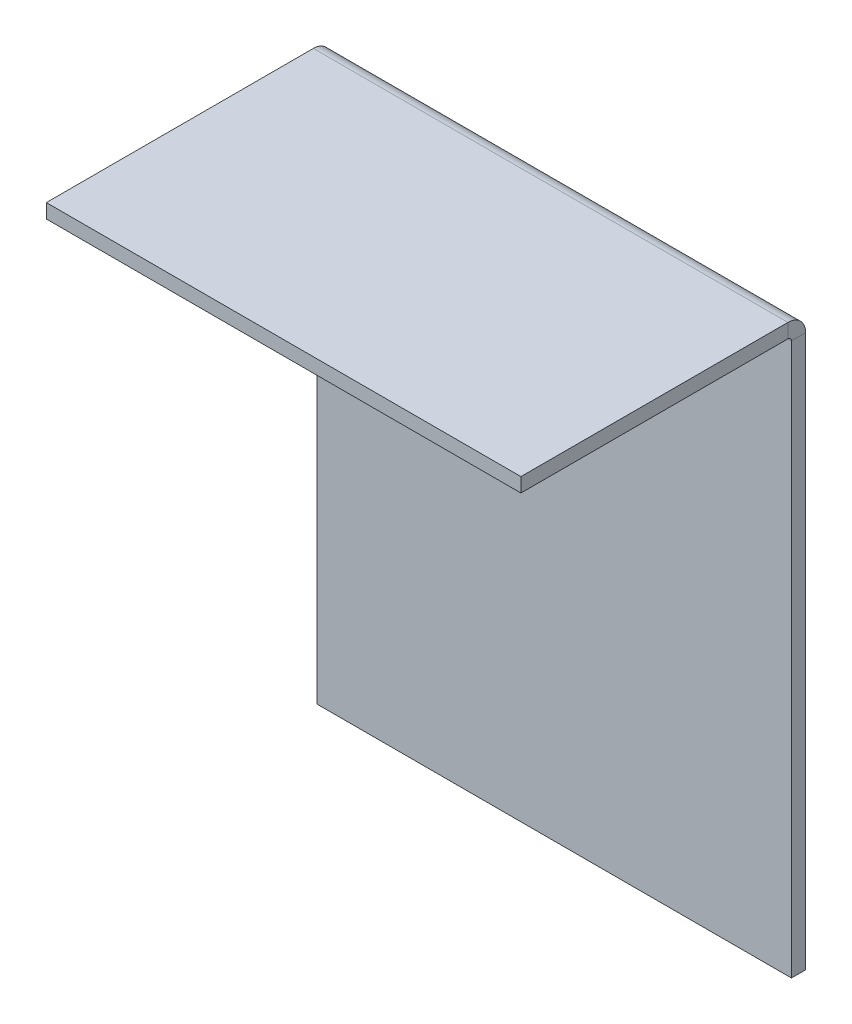
ISO-10303-21;
HEADER;
FILE_DESCRIPTION(('STEP AP214'),'2;1');
FILE_NAME('part.step','',(''),(''),'','','');
FILE_SCHEMA(('AUTOMOTIVE_DESIGN { 1 0 10303 214 1 1 1 1 }'));
ENDSEC;
DATA;
#1=APPLICATION_CONTEXT('core data for automotive mechanical design processes');
#2=APPLICATION_PROTOCOL_DEFINITION('international standard','automotive_design',2000,#1);
#3=PRODUCT_CONTEXT('',#1,'mechanical');
#4=PRODUCT('Part','Part','',(#3));
#5=PRODUCT_RELATED_PRODUCT_CATEGORY('part','',(#4));
#6=PRODUCT_DEFINITION_FORMATION('','',#4);
#7=PRODUCT_DEFINITION_CONTEXT('part definition',#1,'design');
#8=PRODUCT_DEFINITION('design','',#6,#7);
#9=PRODUCT_DEFINITION_SHAPE('','',#8);
#10=(LENGTH_UNIT() NAMED_UNIT(*) SI_UNIT(.MILLI.,.METRE.));
#11=(NAMED_UNIT(*) PLANE_ANGLE_UNIT() SI_UNIT($,.RADIAN.));
#12=(NAMED_UNIT(*) SI_UNIT($,.STERADIAN.) SOLID_ANGLE_UNIT());
#13=UNCERTAINTY_MEASURE_WITH_UNIT(LENGTH_MEASURE(1.E-05),#10,'distance_accuracy_value','');
#14=(GEOMETRIC_REPRESENTATION_CONTEXT(3) GLOBAL_UNCERTAINTY_ASSIGNED_CONTEXT((#13)) GLOBAL_UNIT_ASSIGNED_CONTEXT((#10,
#11,#12)) REPRESENTATION_CONTEXT('',''));
#15=CARTESIAN_POINT('',(0.,0.,0.));
#16=DIRECTION('',(0.,0.,1.));
#17=DIRECTION('',(1.,0.,0.));
#18=AXIS2_PLACEMENT_3D('',#15,#16,#17);
#19=CARTESIAN_POINT('',(-50.,60.,-3.));
#20=DIRECTION('',(-1.,0.,0.));
#21=DIRECTION('',(0.,-1.,0.));
#22=AXIS2_PLACEMENT_3D('',#19,#20,#21);
#23=PLANE('',#22);
#24=DIRECTION('',(0.,-1.,0.));
#25=VECTOR('',#24,1.);
#26=CARTESIAN_POINT('',(-50.,60.,0.));
#27=LINE('',#26,#25);
#28=CARTESIAN_POINT('',(-50.,56.2634,0.));
#29=VERTEX_POINT('',#28);
#30=CARTESIAN_POINT('',(-50.,-60.,0.));
#31=VERTEX_POINT('',#30);
#32=EDGE_CURVE('E110',#29,#31,#27,.T.);
#33=ORIENTED_EDGE('',*,*,#32,.F.);
#34=DIRECTION('',(0.,0.,-1.));
#35=VECTOR('',#34,1.);
#36=CARTESIAN_POINT('',(-50.,56.2634,0.));
#37=LINE('',#36,#35);
#38=CARTESIAN_POINT('',(-50.,56.2634,-3.));
#39=VERTEX_POINT('',#38);
#40=EDGE_CURVE('E118',#29,#39,#37,.T.);
#41=ORIENTED_EDGE('',*,*,#40,.T.);
#42=DIRECTION('',(0.,-1.,0.));
#43=VECTOR('',#42,1.);
#44=CARTESIAN_POINT('',(-50.,60.,-3.));
#45=LINE('',#44,#43);
#46=CARTESIAN_POINT('',(-50.,-60.,-3.));
#47=VERTEX_POINT('',#46);
#48=EDGE_CURVE('E114',#39,#47,#45,.T.);
#49=ORIENTED_EDGE('',*,*,#48,.T.);
#50=DIRECTION('',(0.,0.,1.));
#51=VECTOR('',#50,1.);
#52=CARTESIAN_POINT('',(-50.,-60.,-3.));
#53=LINE('',#52,#51);
#54=EDGE_CURVE('E69',#47,#31,#53,.T.);
#55=ORIENTED_EDGE('',*,*,#54,.T.);
#56=EDGE_LOOP('',(#33,#41,#49,#55));
#57=FACE_BOUND('',#56,.T.);
#58=ADVANCED_FACE('F62',(#57),#23,.T.);
#59=CARTESIAN_POINT('',(0.,0.,-3.));
#60=DIRECTION('',(0.,0.,1.));
#61=DIRECTION('',(1.,0.,0.));
#62=AXIS2_PLACEMENT_3D('',#59,#60,#61);
#63=PLANE('',#62);
#64=DIRECTION('',(-1.,0.,0.));
#65=VECTOR('',#64,1.);
#66=CARTESIAN_POINT('',(-50.,56.2634,-3.));
#67=LINE('',#66,#65);
#68=CARTESIAN_POINT('',(50.,56.2634,-3.));
#69=VERTEX_POINT('',#68);
#70=EDGE_CURVE('E131',#39,#69,#67,.F.);
#71=ORIENTED_EDGE('',*,*,#70,.T.);
#72=DIRECTION('',(0.,1.,0.));
#73=VECTOR('',#72,1.);
#74=CARTESIAN_POINT('',(50.,60.,-3.));
#75=LINE('',#74,#73);
#76=CARTESIAN_POINT('',(50.,-60.,-3.));
#77=VERTEX_POINT('',#76);
#78=EDGE_CURVE('E112',#77,#69,#75,.T.);
#79=ORIENTED_EDGE('',*,*,#78,.F.);
#80=DIRECTION('',(1.,0.,0.));
#81=VECTOR('',#80,1.);
#82=CARTESIAN_POINT('',(-50.,-60.,-3.));
#83=LINE('',#82,#81);
#84=EDGE_CURVE('E101',#47,#77,#83,.T.);
#85=ORIENTED_EDGE('',*,*,#84,.F.);
#86=ORIENTED_EDGE('',*,*,#48,.F.);
#87=EDGE_LOOP('',(#71,#79,#85,#86));
#88=FACE_BOUND('',#87,.T.);
#89=ADVANCED_FACE('F213',(#88),#63,.F.);
#90=CARTESIAN_POINT('',(0.,0.,0.));
#91=DIRECTION('',(0.,0.,1.));
#92=DIRECTION('',(1.,0.,0.));
#93=AXIS2_PLACEMENT_3D('',#90,#91,#92);
#94=PLANE('',#93);
#95=DIRECTION('',(0.,1.,0.));
#96=VECTOR('',#95,1.);
#97=CARTESIAN_POINT('',(50.,60.,0.));
#98=LINE('',#97,#96);
#99=CARTESIAN_POINT('',(50.,-60.,0.));
#100=VERTEX_POINT('',#99);
#101=CARTESIAN_POINT('',(50.,56.2634,0.));
#102=VERTEX_POINT('',#101);
#103=EDGE_CURVE('E103',#100,#102,#98,.T.);
#104=ORIENTED_EDGE('',*,*,#103,.T.);
#105=DIRECTION('',(-1.,0.,0.));
#106=VECTOR('',#105,1.);
#107=CARTESIAN_POINT('',(-50.,56.2634,0.));
#108=LINE('',#107,#106);
#109=EDGE_CURVE('E79',#29,#102,#108,.F.);
#110=ORIENTED_EDGE('',*,*,#109,.F.);
#111=ORIENTED_EDGE('',*,*,#32,.T.);
#112=DIRECTION('',(1.,0.,0.));
#113=VECTOR('',#112,1.);
#114=CARTESIAN_POINT('',(-50.,-60.,0.));
#115=LINE('',#114,#113);
#116=EDGE_CURVE('E97',#31,#100,#115,.T.);
#117=ORIENTED_EDGE('',*,*,#116,.T.);
#118=EDGE_LOOP('',(#104,#110,#111,#117));
#119=FACE_BOUND('',#118,.T.);
#120=ADVANCED_FACE('F108',(#119),#94,.T.);
#121=CARTESIAN_POINT('',(50.,60.,-3.));
#122=DIRECTION('',(1.,0.,0.));
#123=DIRECTION('',(0.,1.,0.));
#124=AXIS2_PLACEMENT_3D('',#121,#122,#123);
#125=PLANE('',#124);
#126=DIRECTION('',(0.,0.,-1.));
#127=VECTOR('',#126,1.);
#128=CARTESIAN_POINT('',(50.,56.2634,0.));
#129=LINE('',#128,#127);
#130=EDGE_CURVE('E106',#102,#69,#129,.T.);
#131=ORIENTED_EDGE('',*,*,#130,.F.);
#132=ORIENTED_EDGE('',*,*,#103,.F.);
#133=DIRECTION('',(0.,0.,1.));
#134=VECTOR('',#133,1.);
#135=CARTESIAN_POINT('',(50.,-60.,-3.));
#136=LINE('',#135,#134);
#137=EDGE_CURVE('E13',#77,#100,#136,.T.);
#138=ORIENTED_EDGE('',*,*,#137,.F.);
#139=ORIENTED_EDGE('',*,*,#78,.T.);
#140=EDGE_LOOP('',(#131,#132,#138,#139));
#141=FACE_BOUND('',#140,.T.);
#142=ADVANCED_FACE('F63',(#141),#125,.T.);
#143=CARTESIAN_POINT('',(-50.,-60.,-3.));
#144=DIRECTION('',(0.,-1.,0.));
#145=DIRECTION('',(0.,0.,-1.));
#146=AXIS2_PLACEMENT_3D('',#143,#144,#145);
#147=PLANE('',#146);
#148=ORIENTED_EDGE('',*,*,#116,.F.);
#149=ORIENTED_EDGE('',*,*,#54,.F.);
#150=ORIENTED_EDGE('',*,*,#84,.T.);
#151=ORIENTED_EDGE('',*,*,#137,.T.);
#152=EDGE_LOOP('',(#148,#149,#150,#151));
#153=FACE_BOUND('',#152,.T.);
#154=ADVANCED_FACE('F96',(#153),#147,.T.);
#155=CARTESIAN_POINT('',(50.,56.2634,0.7366));
#156=DIRECTION('',(1.,0.,0.));
#157=DIRECTION('',(0.,0.,-1.));
#158=AXIS2_PLACEMENT_3D('',#155,#156,#157);
#159=PLANE('',#158);
#160=DIRECTION('',(0.,-1.,0.));
#161=VECTOR('',#160,1.);
#162=CARTESIAN_POINT('',(50.,60.,0.736599999999986));
#163=LINE('',#162,#161);
#164=CARTESIAN_POINT('',(50.,57.,0.736599999999997));
#165=VERTEX_POINT('',#164);
#166=CARTESIAN_POINT('',(50.,60.,0.736599999999986));
#167=VERTEX_POINT('',#166);
#168=EDGE_CURVE('E139',#165,#167,#163,.F.);
#169=ORIENTED_EDGE('',*,*,#168,.F.);
#170=CARTESIAN_POINT('',(50.,56.2634,0.7366));
#171=DIRECTION('',(-1.,0.,0.));
#172=DIRECTION('',(0.,0.,1.));
#173=AXIS2_PLACEMENT_3D('',#170,#171,#172);
#174=CIRCLE('',#173,0.736599999999997);
#175=EDGE_CURVE('E129',#102,#165,#174,.F.);
#176=ORIENTED_EDGE('',*,*,#175,.F.);
#177=ORIENTED_EDGE('',*,*,#130,.T.);
#178=CARTESIAN_POINT('',(50.,56.2634,0.7366));
#179=DIRECTION('',(-1.,0.,0.));
#180=DIRECTION('',(0.,0.,1.));
#181=AXIS2_PLACEMENT_3D('',#178,#179,#180);
#182=CIRCLE('',#181,3.7366);
#183=EDGE_CURVE('E121',#69,#167,#182,.F.);
#184=ORIENTED_EDGE('',*,*,#183,.T.);
#185=EDGE_LOOP('',(#169,#176,#177,#184));
#186=FACE_BOUND('',#185,.T.);
#187=ADVANCED_FACE('F220',(#186),#159,.T.);
#188=CARTESIAN_POINT('',(-50.,56.2634,0.7366));
#189=DIRECTION('',(1.,0.,0.));
#190=DIRECTION('',(0.,0.,-1.));
#191=AXIS2_PLACEMENT_3D('',#188,#189,#190);
#192=PLANE('',#191);
#193=CARTESIAN_POINT('',(-50.,56.2634,0.7366));
#194=DIRECTION('',(-1.,0.,0.));
#195=DIRECTION('',(0.,0.,1.));
#196=AXIS2_PLACEMENT_3D('',#193,#194,#195);
#197=CIRCLE('',#196,0.736599999999997);
#198=CARTESIAN_POINT('',(-50.,57.,0.736599999999997));
#199=VERTEX_POINT('',#198);
#200=EDGE_CURVE('E123',#199,#29,#197,.T.);
#201=ORIENTED_EDGE('',*,*,#200,.F.);
#202=DIRECTION('',(0.,-1.,0.));
#203=VECTOR('',#202,1.);
#204=CARTESIAN_POINT('',(-50.,57.,0.736599999999997));
#205=LINE('',#204,#203);
#206=CARTESIAN_POINT('',(-50.,60.,0.736599999999986));
#207=VERTEX_POINT('',#206);
#208=EDGE_CURVE('E148',#199,#207,#205,.F.);
#209=ORIENTED_EDGE('',*,*,#208,.T.);
#210=CARTESIAN_POINT('',(-50.,56.2634,0.7366));
#211=DIRECTION('',(-1.,0.,0.));
#212=DIRECTION('',(0.,0.,1.));
#213=AXIS2_PLACEMENT_3D('',#210,#211,#212);
#214=CIRCLE('',#213,3.7366);
#215=EDGE_CURVE('E134',#207,#39,#214,.T.);
#216=ORIENTED_EDGE('',*,*,#215,.T.);
#217=ORIENTED_EDGE('',*,*,#40,.F.);
#218=EDGE_LOOP('',(#201,#209,#216,#217));
#219=FACE_BOUND('',#218,.T.);
#220=ADVANCED_FACE('F227',(#219),#192,.F.);
#221=CARTESIAN_POINT('',(-50.,56.2634,0.7366));
#222=DIRECTION('',(-1.,0.,0.));
#223=DIRECTION('',(0.,1.,0.));
#224=AXIS2_PLACEMENT_3D('',#221,#222,#223);
#225=CYLINDRICAL_SURFACE('',#224,3.7366);
#226=ORIENTED_EDGE('',*,*,#70,.F.);
#227=ORIENTED_EDGE('',*,*,#215,.F.);
#228=DIRECTION('',(-1.,0.,0.));
#229=VECTOR('',#228,1.);
#230=CARTESIAN_POINT('',(50.,60.,0.736599999999986));
#231=LINE('',#230,#229);
#232=EDGE_CURVE('E149',#207,#167,#231,.F.);
#233=ORIENTED_EDGE('',*,*,#232,.T.);
#234=ORIENTED_EDGE('',*,*,#183,.F.);
#235=EDGE_LOOP('',(#226,#227,#233,#234));
#236=FACE_BOUND('',#235,.T.);
#237=ADVANCED_FACE('F217',(#236),#225,.T.);
#238=CARTESIAN_POINT('',(-50.,56.2634,0.7366));
#239=DIRECTION('',(-1.,0.,0.));
#240=DIRECTION('',(0.,1.,0.));
#241=AXIS2_PLACEMENT_3D('',#238,#239,#240);
#242=CYLINDRICAL_SURFACE('',#241,0.736599999999997);
#243=ORIENTED_EDGE('',*,*,#109,.T.);
#244=ORIENTED_EDGE('',*,*,#175,.T.);
#245=DIRECTION('',(-1.,0.,0.));
#246=VECTOR('',#245,1.);
#247=CARTESIAN_POINT('',(50.,57.,0.736599999999997));
#248=LINE('',#247,#246);
#249=EDGE_CURVE('E141',#165,#199,#248,.T.);
#250=ORIENTED_EDGE('',*,*,#249,.T.);
#251=ORIENTED_EDGE('',*,*,#200,.T.);
#252=EDGE_LOOP('',(#243,#244,#250,#251));
#253=FACE_BOUND('',#252,.T.);
#254=ADVANCED_FACE('F230',(#253),#242,.F.);
#255=CARTESIAN_POINT('',(50.,60.,0.));
#256=DIRECTION('',(-1.,0.,0.));
#257=DIRECTION('',(0.,0.,1.));
#258=AXIS2_PLACEMENT_3D('',#255,#256,#257);
#259=PLANE('',#258);
#260=ORIENTED_EDGE('',*,*,#168,.T.);
#261=DIRECTION('',(0.,0.,-1.));
#262=VECTOR('',#261,1.);
#263=CARTESIAN_POINT('',(50.,60.,-2.22293310556855E-13));
#264=LINE('',#263,#262);
#265=CARTESIAN_POINT('',(50.,60.0000000000002,57.));
#266=VERTEX_POINT('',#265);
#267=EDGE_CURVE('E161',#266,#167,#264,.T.);
#268=ORIENTED_EDGE('',*,*,#267,.F.);
#269=DIRECTION('',(0.,-1.,0.));
#270=VECTOR('',#269,1.);
#271=CARTESIAN_POINT('',(50.,60.0000000000002,57.));
#272=LINE('',#271,#270);
#273=CARTESIAN_POINT('',(50.,57.0000000000002,57.));
#274=VERTEX_POINT('',#273);
#275=EDGE_CURVE('E168',#266,#274,#272,.T.);
#276=ORIENTED_EDGE('',*,*,#275,.T.);
#277=DIRECTION('',(0.,0.,1.));
#278=VECTOR('',#277,1.);
#279=CARTESIAN_POINT('',(50.,57.,0.));
#280=LINE('',#279,#278);
#281=EDGE_CURVE('E155',#274,#165,#280,.F.);
#282=ORIENTED_EDGE('',*,*,#281,.T.);
#283=EDGE_LOOP('',(#260,#268,#276,#282));
#284=FACE_BOUND('',#283,.T.);
#285=ADVANCED_FACE('F198',(#284),#259,.F.);
#286=CARTESIAN_POINT('',(-50.,60.0000000000002,57.));
#287=DIRECTION('',(1.,0.,0.));
#288=DIRECTION('',(0.,0.,-1.));
#289=AXIS2_PLACEMENT_3D('',#286,#287,#288);
#290=PLANE('',#289);
#291=ORIENTED_EDGE('',*,*,#208,.F.);
#292=DIRECTION('',(0.,0.,-1.));
#293=VECTOR('',#292,1.);
#294=CARTESIAN_POINT('',(-50.,57.0000000000002,57.));
#295=LINE('',#294,#293);
#296=CARTESIAN_POINT('',(-50.,57.0000000000002,57.));
#297=VERTEX_POINT('',#296);
#298=EDGE_CURVE('E154',#199,#297,#295,.F.);
#299=ORIENTED_EDGE('',*,*,#298,.T.);
#300=DIRECTION('',(0.,-1.,0.));
#301=VECTOR('',#300,1.);
#302=CARTESIAN_POINT('',(-50.,60.0000000000002,57.));
#303=LINE('',#302,#301);
#304=CARTESIAN_POINT('',(-50.,60.0000000000002,57.));
#305=VERTEX_POINT('',#304);
#306=EDGE_CURVE('E130',#305,#297,#303,.T.);
#307=ORIENTED_EDGE('',*,*,#306,.F.);
#308=DIRECTION('',(0.,0.,1.));
#309=VECTOR('',#308,1.);
#310=CARTESIAN_POINT('',(-50.,60.,-2.22293310556855E-13));
#311=LINE('',#310,#309);
#312=EDGE_CURVE('E163',#207,#305,#311,.T.);
#313=ORIENTED_EDGE('',*,*,#312,.F.);
#314=EDGE_LOOP('',(#291,#299,#307,#313));
#315=FACE_BOUND('',#314,.T.);
#316=ADVANCED_FACE('F221',(#315),#290,.F.);
#317=CARTESIAN_POINT('',(0.,60.,-2.22293310556855E-13));
#318=DIRECTION('',(0.,-1.,0.));
#319=DIRECTION('',(0.,0.,-1.));
#320=AXIS2_PLACEMENT_3D('',#317,#318,#319);
#321=PLANE('',#320);
#322=ORIENTED_EDGE('',*,*,#232,.F.);
#323=ORIENTED_EDGE('',*,*,#312,.T.);
#324=DIRECTION('',(1.,0.,0.));
#325=VECTOR('',#324,1.);
#326=CARTESIAN_POINT('',(0.,60.0000000000002,57.));
#327=LINE('',#326,#325);
#328=EDGE_CURVE('E170',#305,#266,#327,.T.);
#329=ORIENTED_EDGE('',*,*,#328,.T.);
#330=ORIENTED_EDGE('',*,*,#267,.T.);
#331=EDGE_LOOP('',(#322,#323,#329,#330));
#332=FACE_BOUND('',#331,.T.);
#333=ADVANCED_FACE('F222',(#332),#321,.F.);
#334=CARTESIAN_POINT('',(0.,57.,-2.11818866540326E-13));
#335=DIRECTION('',(0.,-1.,0.));
#336=DIRECTION('',(0.,0.,-1.));
#337=AXIS2_PLACEMENT_3D('',#334,#335,#336);
#338=PLANE('',#337);
#339=ORIENTED_EDGE('',*,*,#298,.F.);
#340=ORIENTED_EDGE('',*,*,#249,.F.);
#341=ORIENTED_EDGE('',*,*,#281,.F.);
#342=DIRECTION('',(-1.,0.,0.));
#343=VECTOR('',#342,1.);
#344=CARTESIAN_POINT('',(50.,57.0000000000002,57.));
#345=LINE('',#344,#343);
#346=EDGE_CURVE('E158',#297,#274,#345,.F.);
#347=ORIENTED_EDGE('',*,*,#346,.F.);
#348=EDGE_LOOP('',(#339,#340,#341,#347));
#349=FACE_BOUND('',#348,.T.);
#350=ADVANCED_FACE('F186',(#349),#338,.T.);
#351=CARTESIAN_POINT('',(50.,60.0000000000002,57.));
#352=DIRECTION('',(0.,0.,-1.));
#353=DIRECTION('',(0.,1.,0.));
#354=AXIS2_PLACEMENT_3D('',#351,#352,#353);
#355=PLANE('',#354);
#356=ORIENTED_EDGE('',*,*,#346,.T.);
#357=ORIENTED_EDGE('',*,*,#275,.F.);
#358=ORIENTED_EDGE('',*,*,#328,.F.);
#359=ORIENTED_EDGE('',*,*,#306,.T.);
#360=EDGE_LOOP('',(#356,#357,#358,#359));
#361=FACE_BOUND('',#360,.T.);
#362=ADVANCED_FACE('F178',(#361),#355,.F.);
#363=CLOSED_SHELL('',(#58,#89,#120,#142,#154,#187,#220,#237,#254,#285,#316,#333,#350,#362));
#364=MANIFOLD_SOLID_BREP('B2',#363);
#365=ADVANCED_BREP_SHAPE_REPRESENTATION('',(#18,#364),#14);
#366=SHAPE_DEFINITION_REPRESENTATION(#9,#365);
ENDSEC;
END-ISO-10303-21;
